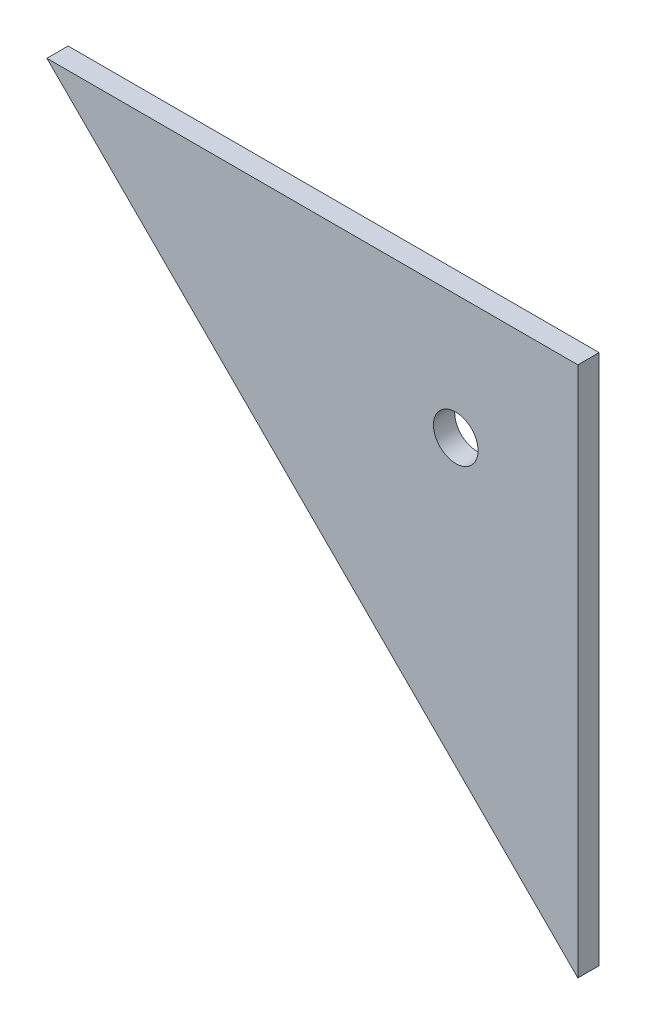
ISO-10303-21;
HEADER;
FILE_DESCRIPTION(('STEP AP214'),'2;1');
FILE_NAME('part.step','',(''),(''),'','','');
FILE_SCHEMA(('AUTOMOTIVE_DESIGN { 1 0 10303 214 1 1 1 1 }'));
ENDSEC;
DATA;
#1=APPLICATION_CONTEXT('core data for automotive mechanical design processes');
#2=APPLICATION_PROTOCOL_DEFINITION('international standard','automotive_design',2000,#1);
#3=PRODUCT_CONTEXT('',#1,'mechanical');
#4=PRODUCT('Part','Part','',(#3));
#5=PRODUCT_RELATED_PRODUCT_CATEGORY('part','',(#4));
#6=PRODUCT_DEFINITION_FORMATION('','',#4);
#7=PRODUCT_DEFINITION_CONTEXT('part definition',#1,'design');
#8=PRODUCT_DEFINITION('design','',#6,#7);
#9=PRODUCT_DEFINITION_SHAPE('','',#8);
#10=(LENGTH_UNIT() NAMED_UNIT(*) SI_UNIT(.MILLI.,.METRE.));
#11=(NAMED_UNIT(*) PLANE_ANGLE_UNIT() SI_UNIT($,.RADIAN.));
#12=(NAMED_UNIT(*) SI_UNIT($,.STERADIAN.) SOLID_ANGLE_UNIT());
#13=UNCERTAINTY_MEASURE_WITH_UNIT(LENGTH_MEASURE(1.E-05),#10,'distance_accuracy_value','');
#14=(GEOMETRIC_REPRESENTATION_CONTEXT(3) GLOBAL_UNCERTAINTY_ASSIGNED_CONTEXT((#13)) GLOBAL_UNIT_ASSIGNED_CONTEXT((#10,
#11,#12)) REPRESENTATION_CONTEXT('',''));
#15=CARTESIAN_POINT('',(0.,0.,0.));
#16=DIRECTION('',(0.,0.,1.));
#17=DIRECTION('',(1.,0.,0.));
#18=AXIS2_PLACEMENT_3D('',#15,#16,#17);
#19=CARTESIAN_POINT('',(358.3,500.,-903.));
#20=DIRECTION('',(0.,-1.,0.));
#21=DIRECTION('',(0.,0.,-1.));
#22=AXIS2_PLACEMENT_3D('',#19,#20,#21);
#23=PLANE('',#22);
#24=DIRECTION('',(0.,0.,1.));
#25=VECTOR('',#24,1.);
#26=CARTESIAN_POINT('',(1175.,500.,-829.));
#27=LINE('',#26,#25);
#28=CARTESIAN_POINT('',(1175.,500.,-905.));
#29=VERTEX_POINT('',#28);
#30=CARTESIAN_POINT('',(1175.,500.,-903.));
#31=VERTEX_POINT('',#30);
#32=EDGE_CURVE('E88',#29,#31,#27,.T.);
#33=ORIENTED_EDGE('',*,*,#32,.F.);
#34=DIRECTION('',(-1.,0.,0.));
#35=VECTOR('',#34,1.);
#36=CARTESIAN_POINT('',(1175.,500.,-905.));
#37=LINE('',#36,#35);
#38=CARTESIAN_POINT('',(1125.,500.,-905.));
#39=VERTEX_POINT('',#38);
#40=EDGE_CURVE('E46',#29,#39,#37,.T.);
#41=ORIENTED_EDGE('',*,*,#40,.T.);
#42=DIRECTION('',(0.,0.,-1.));
#43=VECTOR('',#42,1.);
#44=CARTESIAN_POINT('',(1125.,500.,-903.));
#45=LINE('',#44,#43);
#46=CARTESIAN_POINT('',(1125.,500.,-903.));
#47=VERTEX_POINT('',#46);
#48=EDGE_CURVE('E102',#47,#39,#45,.T.);
#49=ORIENTED_EDGE('',*,*,#48,.F.);
#50=DIRECTION('',(-1.,0.,0.));
#51=VECTOR('',#50,1.);
#52=CARTESIAN_POINT('',(1175.,500.,-903.));
#53=LINE('',#52,#51);
#54=EDGE_CURVE('E90',#31,#47,#53,.T.);
#55=ORIENTED_EDGE('',*,*,#54,.F.);
#56=EDGE_LOOP('',(#33,#41,#49,#55));
#57=FACE_BOUND('',#56,.T.);
#58=ADVANCED_FACE('F42',(#57),#23,.F.);
#59=CARTESIAN_POINT('',(1163.5,488.3,-903.));
#60=DIRECTION('',(0.,0.,-1.));
#61=DIRECTION('',(1.,0.,0.));
#62=AXIS2_PLACEMENT_3D('',#59,#60,#61);
#63=CYLINDRICAL_SURFACE('',#62,2.09999999999993);
#64=CARTESIAN_POINT('',(1163.5,488.3,-903.));
#65=DIRECTION('',(0.,0.,1.));
#66=DIRECTION('',(-1.,0.,0.));
#67=AXIS2_PLACEMENT_3D('',#64,#65,#66);
#68=CIRCLE('',#67,2.09999999999993);
#69=CARTESIAN_POINT('',(1161.4,488.3,-903.));
#70=VERTEX_POINT('',#69);
#71=EDGE_CURVE('E97',#70,#70,#68,.T.);
#72=ORIENTED_EDGE('',*,*,#71,.T.);
#73=EDGE_LOOP('',(#72));
#74=FACE_BOUND('',#73,.T.);
#75=CARTESIAN_POINT('',(1163.5,488.3,-905.));
#76=DIRECTION('',(0.,0.,1.));
#77=DIRECTION('',(-1.,0.,0.));
#78=AXIS2_PLACEMENT_3D('',#75,#76,#77);
#79=CIRCLE('',#78,2.09999999999993);
#80=CARTESIAN_POINT('',(1161.4,488.3,-905.));
#81=VERTEX_POINT('',#80);
#82=EDGE_CURVE('E94',#81,#81,#79,.T.);
#83=ORIENTED_EDGE('',*,*,#82,.F.);
#84=EDGE_LOOP('',(#83));
#85=FACE_BOUND('',#84,.T.);
#86=ADVANCED_FACE('F119',(#74,#85),#63,.F.);
#87=CARTESIAN_POINT('',(0.,0.,-903.));
#88=DIRECTION('',(0.,0.,-1.));
#89=DIRECTION('',(1.,0.,0.));
#90=AXIS2_PLACEMENT_3D('',#87,#88,#89);
#91=PLANE('',#90);
#92=ORIENTED_EDGE('',*,*,#71,.F.);
#93=EDGE_LOOP('',(#92));
#94=FACE_BOUND('',#93,.T.);
#95=DIRECTION('',(0.707106781186548,-0.707106781186547,0.));
#96=VECTOR('',#95,1.);
#97=CARTESIAN_POINT('',(1125.,500.,-903.));
#98=LINE('',#97,#96);
#99=CARTESIAN_POINT('',(1175.,450.,-903.));
#100=VERTEX_POINT('',#99);
#101=EDGE_CURVE('E103',#47,#100,#98,.T.);
#102=ORIENTED_EDGE('',*,*,#101,.T.);
#103=DIRECTION('',(0.,1.,0.));
#104=VECTOR('',#103,1.);
#105=CARTESIAN_POINT('',(1175.,450.,-903.));
#106=LINE('',#105,#104);
#107=EDGE_CURVE('E92',#100,#31,#106,.T.);
#108=ORIENTED_EDGE('',*,*,#107,.T.);
#109=ORIENTED_EDGE('',*,*,#54,.T.);
#110=EDGE_LOOP('',(#102,#108,#109));
#111=FACE_BOUND('',#110,.T.);
#112=ADVANCED_FACE('F123',(#94,#111),#91,.F.);
#113=CARTESIAN_POINT('',(1175.,500.,-829.));
#114=DIRECTION('',(-1.,0.,0.));
#115=DIRECTION('',(0.,0.,1.));
#116=AXIS2_PLACEMENT_3D('',#113,#114,#115);
#117=PLANE('',#116);
#118=DIRECTION('',(0.,1.,0.));
#119=VECTOR('',#118,1.);
#120=CARTESIAN_POINT('',(1175.,450.,-905.));
#121=LINE('',#120,#119);
#122=CARTESIAN_POINT('',(1175.,450.,-905.));
#123=VERTEX_POINT('',#122);
#124=EDGE_CURVE('E51',#123,#29,#121,.T.);
#125=ORIENTED_EDGE('',*,*,#124,.T.);
#126=ORIENTED_EDGE('',*,*,#32,.T.);
#127=ORIENTED_EDGE('',*,*,#107,.F.);
#128=DIRECTION('',(0.,0.,-1.));
#129=VECTOR('',#128,1.);
#130=CARTESIAN_POINT('',(1175.,450.,-903.));
#131=LINE('',#130,#129);
#132=EDGE_CURVE('E11',#100,#123,#131,.T.);
#133=ORIENTED_EDGE('',*,*,#132,.T.);
#134=EDGE_LOOP('',(#125,#126,#127,#133));
#135=FACE_BOUND('',#134,.T.);
#136=ADVANCED_FACE('F44',(#135),#117,.F.);
#137=CARTESIAN_POINT('',(0.,0.,-905.));
#138=DIRECTION('',(0.,0.,-1.));
#139=DIRECTION('',(1.,0.,0.));
#140=AXIS2_PLACEMENT_3D('',#137,#138,#139);
#141=PLANE('',#140);
#142=ORIENTED_EDGE('',*,*,#82,.T.);
#143=EDGE_LOOP('',(#142));
#144=FACE_BOUND('',#143,.T.);
#145=DIRECTION('',(0.707106781186548,-0.707106781186547,0.));
#146=VECTOR('',#145,1.);
#147=CARTESIAN_POINT('',(1125.,500.,-905.));
#148=LINE('',#147,#146);
#149=EDGE_CURVE('E85',#39,#123,#148,.T.);
#150=ORIENTED_EDGE('',*,*,#149,.F.);
#151=ORIENTED_EDGE('',*,*,#40,.F.);
#152=ORIENTED_EDGE('',*,*,#124,.F.);
#153=EDGE_LOOP('',(#150,#151,#152));
#154=FACE_BOUND('',#153,.T.);
#155=ADVANCED_FACE('F84',(#144,#154),#141,.T.);
#156=CARTESIAN_POINT('',(1125.,500.,-903.));
#157=DIRECTION('',(-0.707106781186547,-0.707106781186548,0.));
#158=DIRECTION('',(0.707106781186548,-0.707106781186547,0.));
#159=AXIS2_PLACEMENT_3D('',#156,#157,#158);
#160=PLANE('',#159);
#161=ORIENTED_EDGE('',*,*,#149,.T.);
#162=ORIENTED_EDGE('',*,*,#132,.F.);
#163=ORIENTED_EDGE('',*,*,#101,.F.);
#164=ORIENTED_EDGE('',*,*,#48,.T.);
#165=EDGE_LOOP('',(#161,#162,#163,#164));
#166=FACE_BOUND('',#165,.T.);
#167=ADVANCED_FACE('F109',(#166),#160,.T.);
#168=CLOSED_SHELL('',(#58,#86,#112,#136,#155,#167));
#169=MANIFOLD_SOLID_BREP('B2',#168);
#170=ADVANCED_BREP_SHAPE_REPRESENTATION('',(#18,#169),#14);
#171=SHAPE_DEFINITION_REPRESENTATION(#9,#170);
ENDSEC;
END-ISO-10303-21;
